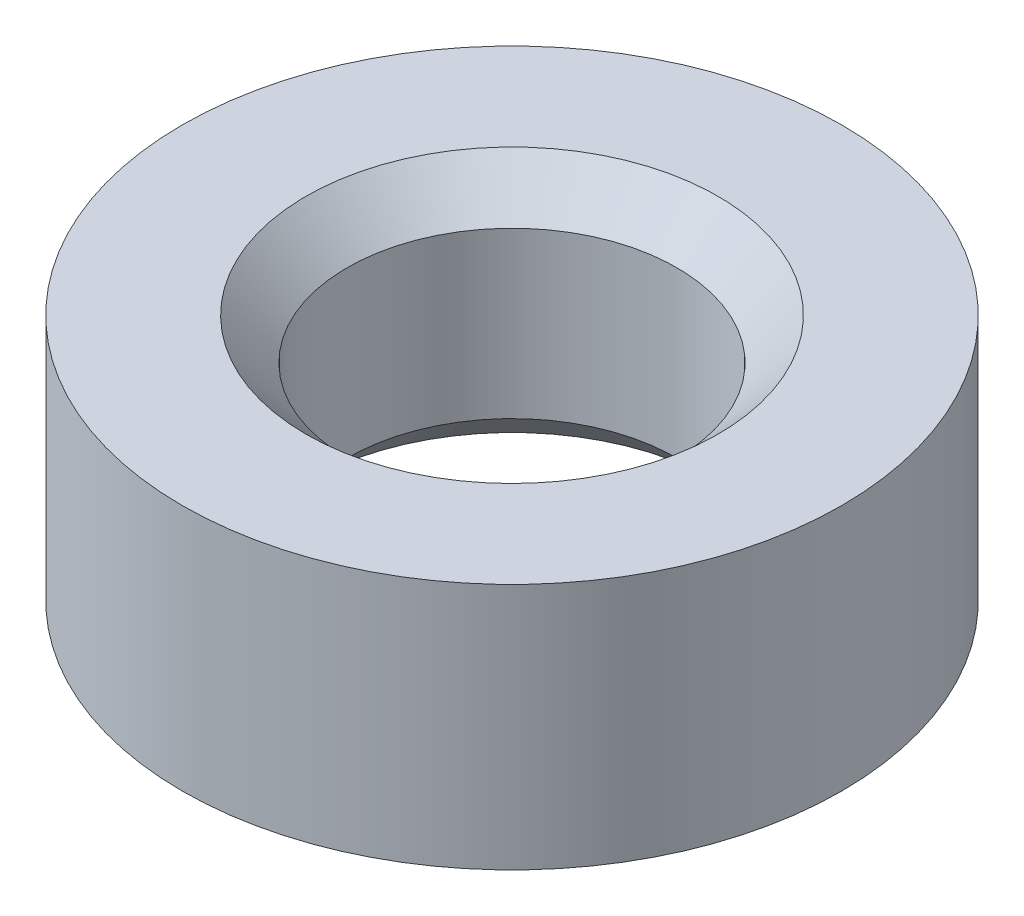
ISO-10303-21;
HEADER;
FILE_DESCRIPTION(('STEP AP214'),'2;1');
FILE_NAME('part.step','',(''),(''),'','','');
FILE_SCHEMA(('AUTOMOTIVE_DESIGN { 1 0 10303 214 1 1 1 1 }'));
ENDSEC;
DATA;
#1=APPLICATION_CONTEXT('core data for automotive mechanical design processes');
#2=APPLICATION_PROTOCOL_DEFINITION('international standard','automotive_design',2000,#1);
#3=PRODUCT_CONTEXT('',#1,'mechanical');
#4=PRODUCT('Part','Part','',(#3));
#5=PRODUCT_RELATED_PRODUCT_CATEGORY('part','',(#4));
#6=PRODUCT_DEFINITION_FORMATION('','',#4);
#7=PRODUCT_DEFINITION_CONTEXT('part definition',#1,'design');
#8=PRODUCT_DEFINITION('design','',#6,#7);
#9=PRODUCT_DEFINITION_SHAPE('','',#8);
#10=(LENGTH_UNIT() NAMED_UNIT(*) SI_UNIT(.MILLI.,.METRE.));
#11=(NAMED_UNIT(*) PLANE_ANGLE_UNIT() SI_UNIT($,.RADIAN.));
#12=(NAMED_UNIT(*) SI_UNIT($,.STERADIAN.) SOLID_ANGLE_UNIT());
#13=UNCERTAINTY_MEASURE_WITH_UNIT(LENGTH_MEASURE(1.E-05),#10,'distance_accuracy_value','');
#14=(GEOMETRIC_REPRESENTATION_CONTEXT(3) GLOBAL_UNCERTAINTY_ASSIGNED_CONTEXT((#13)) GLOBAL_UNIT_ASSIGNED_CONTEXT((#10,
#11,#12)) REPRESENTATION_CONTEXT('',''));
#15=CARTESIAN_POINT('',(0.,0.,0.));
#16=DIRECTION('',(0.,0.,1.));
#17=DIRECTION('',(1.,0.,0.));
#18=AXIS2_PLACEMENT_3D('',#15,#16,#17);
#19=CARTESIAN_POINT('',(0.,3.,0.));
#20=DIRECTION('',(0.,-1.,0.));
#21=DIRECTION('',(0.,0.,-1.));
#22=AXIS2_PLACEMENT_3D('',#19,#20,#21);
#23=CYLINDRICAL_SURFACE('',#22,4.);
#24=CARTESIAN_POINT('',(0.,3.,0.));
#25=DIRECTION('',(0.,1.,0.));
#26=DIRECTION('',(0.,0.,1.));
#27=AXIS2_PLACEMENT_3D('',#24,#25,#26);
#28=CIRCLE('',#27,4.);
#29=CARTESIAN_POINT('',(0.,3.,4.));
#30=VERTEX_POINT('',#29);
#31=EDGE_CURVE('E52',#30,#30,#28,.T.);
#32=ORIENTED_EDGE('',*,*,#31,.F.);
#33=EDGE_LOOP('',(#32));
#34=FACE_BOUND('',#33,.T.);
#35=CARTESIAN_POINT('',(0.,0.,0.));
#36=DIRECTION('',(0.,1.,0.));
#37=DIRECTION('',(0.,0.,1.));
#38=AXIS2_PLACEMENT_3D('',#35,#36,#37);
#39=CIRCLE('',#38,4.);
#40=CARTESIAN_POINT('',(0.,0.,4.));
#41=VERTEX_POINT('',#40);
#42=EDGE_CURVE('E53',#41,#41,#39,.T.);
#43=ORIENTED_EDGE('',*,*,#42,.T.);
#44=EDGE_LOOP('',(#43));
#45=FACE_BOUND('',#44,.T.);
#46=ADVANCED_FACE('F32',(#34,#45),#23,.T.);
#47=CARTESIAN_POINT('',(0.,3.,0.));
#48=DIRECTION('',(0.,1.,0.));
#49=DIRECTION('',(0.,0.,1.));
#50=AXIS2_PLACEMENT_3D('',#47,#48,#49);
#51=PLANE('',#50);
#52=CARTESIAN_POINT('',(0.,3.,0.));
#53=DIRECTION('',(0.,1.,0.));
#54=DIRECTION('',(0.,0.,1.));
#55=AXIS2_PLACEMENT_3D('',#52,#53,#54);
#56=CIRCLE('',#55,2.5);
#57=CARTESIAN_POINT('',(0.,3.,2.5));
#58=VERTEX_POINT('',#57);
#59=EDGE_CURVE('E39',#58,#58,#56,.F.);
#60=ORIENTED_EDGE('',*,*,#59,.T.);
#61=EDGE_LOOP('',(#60));
#62=FACE_BOUND('',#61,.T.);
#63=ORIENTED_EDGE('',*,*,#31,.T.);
#64=EDGE_LOOP('',(#63));
#65=FACE_BOUND('',#64,.T.);
#66=ADVANCED_FACE('F59',(#62,#65),#51,.T.);
#67=CARTESIAN_POINT('',(0.,0.,0.));
#68=DIRECTION('',(0.,1.,0.));
#69=DIRECTION('',(0.,0.,1.));
#70=AXIS2_PLACEMENT_3D('',#67,#68,#69);
#71=PLANE('',#70);
#72=CARTESIAN_POINT('',(0.,0.,0.));
#73=DIRECTION('',(0.,1.,0.));
#74=DIRECTION('',(0.,0.,1.));
#75=AXIS2_PLACEMENT_3D('',#72,#73,#74);
#76=CIRCLE('',#75,2.5);
#77=CARTESIAN_POINT('',(0.,0.,2.5));
#78=VERTEX_POINT('',#77);
#79=EDGE_CURVE('E10',#78,#78,#76,.T.);
#80=ORIENTED_EDGE('',*,*,#79,.T.);
#81=EDGE_LOOP('',(#80));
#82=FACE_BOUND('',#81,.T.);
#83=ORIENTED_EDGE('',*,*,#42,.F.);
#84=EDGE_LOOP('',(#83));
#85=FACE_BOUND('',#84,.T.);
#86=ADVANCED_FACE('F66',(#82,#85),#71,.F.);
#87=CARTESIAN_POINT('',(0.,0.,0.));
#88=DIRECTION('',(0.,1.,0.));
#89=DIRECTION('',(0.,0.,1.));
#90=AXIS2_PLACEMENT_3D('',#87,#88,#89);
#91=CYLINDRICAL_SURFACE('',#90,2.);
#92=CARTESIAN_POINT('',(0.,2.5,0.));
#93=DIRECTION('',(0.,1.,0.));
#94=DIRECTION('',(0.,0.,1.));
#95=AXIS2_PLACEMENT_3D('',#92,#93,#94);
#96=CIRCLE('',#95,2.);
#97=CARTESIAN_POINT('',(0.,2.5,2.));
#98=VERTEX_POINT('',#97);
#99=EDGE_CURVE('E43',#98,#98,#96,.T.);
#100=ORIENTED_EDGE('',*,*,#99,.T.);
#101=EDGE_LOOP('',(#100));
#102=FACE_BOUND('',#101,.T.);
#103=CARTESIAN_POINT('',(0.,0.500000000000003,0.));
#104=DIRECTION('',(0.,1.,0.));
#105=DIRECTION('',(0.,0.,1.));
#106=AXIS2_PLACEMENT_3D('',#103,#104,#105);
#107=CIRCLE('',#106,2.);
#108=CARTESIAN_POINT('',(0.,0.500000000000003,2.));
#109=VERTEX_POINT('',#108);
#110=EDGE_CURVE('E47',#109,#109,#107,.F.);
#111=ORIENTED_EDGE('',*,*,#110,.T.);
#112=EDGE_LOOP('',(#111));
#113=FACE_BOUND('',#112,.T.);
#114=ADVANCED_FACE('F68',(#102,#113),#91,.F.);
#115=CARTESIAN_POINT('',(0.,2.5,0.));
#116=DIRECTION('',(0.,1.,0.));
#117=DIRECTION('',(0.,0.,1.));
#118=AXIS2_PLACEMENT_3D('',#115,#116,#117);
#119=CONICAL_SURFACE('',#118,2.,0.785398163397448);
#120=ORIENTED_EDGE('',*,*,#59,.F.);
#121=EDGE_LOOP('',(#120));
#122=FACE_BOUND('',#121,.T.);
#123=ORIENTED_EDGE('',*,*,#99,.F.);
#124=EDGE_LOOP('',(#123));
#125=FACE_BOUND('',#124,.T.);
#126=ADVANCED_FACE('F74',(#122,#125),#119,.F.);
#127=CARTESIAN_POINT('',(0.,0.,0.));
#128=DIRECTION('',(0.,-1.,0.));
#129=DIRECTION('',(0.,0.,-1.));
#130=AXIS2_PLACEMENT_3D('',#127,#128,#129);
#131=CONICAL_SURFACE('',#130,2.5,0.785398163397447);
#132=ORIENTED_EDGE('',*,*,#110,.F.);
#133=EDGE_LOOP('',(#132));
#134=FACE_BOUND('',#133,.T.);
#135=ORIENTED_EDGE('',*,*,#79,.F.);
#136=EDGE_LOOP('',(#135));
#137=FACE_BOUND('',#136,.T.);
#138=ADVANCED_FACE('F34',(#134,#137),#131,.F.);
#139=CLOSED_SHELL('',(#46,#66,#86,#114,#126,#138));
#140=MANIFOLD_SOLID_BREP('B2',#139);
#141=ADVANCED_BREP_SHAPE_REPRESENTATION('',(#18,#140),#14);
#142=SHAPE_DEFINITION_REPRESENTATION(#9,#141);
ENDSEC;
END-ISO-10303-21;
